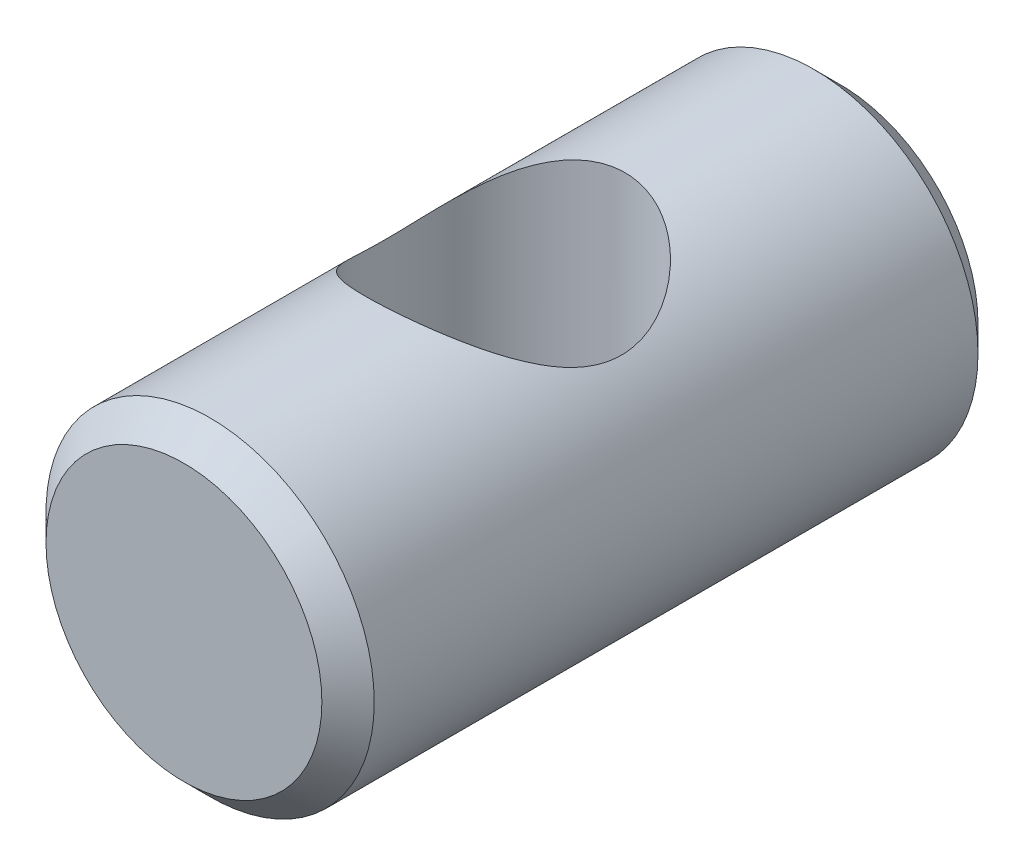
ISO-10303-21;
HEADER;
FILE_DESCRIPTION(('STEP AP214'),'2;1');
FILE_NAME('part.step','',(''),(''),'','','');
FILE_SCHEMA(('AUTOMOTIVE_DESIGN { 1 0 10303 214 1 1 1 1 }'));
ENDSEC;
DATA;
#1=APPLICATION_CONTEXT('core data for automotive mechanical design processes');
#2=APPLICATION_PROTOCOL_DEFINITION('international standard','automotive_design',2000,#1);
#3=PRODUCT_CONTEXT('',#1,'mechanical');
#4=PRODUCT('Part','Part','',(#3));
#5=PRODUCT_RELATED_PRODUCT_CATEGORY('part','',(#4));
#6=PRODUCT_DEFINITION_FORMATION('','',#4);
#7=PRODUCT_DEFINITION_CONTEXT('part definition',#1,'design');
#8=PRODUCT_DEFINITION('design','',#6,#7);
#9=PRODUCT_DEFINITION_SHAPE('','',#8);
#10=(LENGTH_UNIT() NAMED_UNIT(*) SI_UNIT(.MILLI.,.METRE.));
#11=(NAMED_UNIT(*) PLANE_ANGLE_UNIT() SI_UNIT($,.RADIAN.));
#12=(NAMED_UNIT(*) SI_UNIT($,.STERADIAN.) SOLID_ANGLE_UNIT());
#13=UNCERTAINTY_MEASURE_WITH_UNIT(LENGTH_MEASURE(1.E-05),#10,'distance_accuracy_value','');
#14=(GEOMETRIC_REPRESENTATION_CONTEXT(3) GLOBAL_UNCERTAINTY_ASSIGNED_CONTEXT((#13)) GLOBAL_UNIT_ASSIGNED_CONTEXT((#10,
#11,#12)) REPRESENTATION_CONTEXT('',''));
#15=CARTESIAN_POINT('',(0.,0.,0.));
#16=DIRECTION('',(0.,0.,1.));
#17=DIRECTION('',(1.,0.,0.));
#18=AXIS2_PLACEMENT_3D('',#15,#16,#17);
#19=CARTESIAN_POINT('',(0.,0.,9.525));
#20=DIRECTION('',(0.,0.,-1.));
#21=DIRECTION('',(-1.,0.,0.));
#22=AXIS2_PLACEMENT_3D('',#19,#20,#21);
#23=CYLINDRICAL_SURFACE('',#22,4.765);
#24=CARTESIAN_POINT('',(-0.25,-4.75843724346555,3.43));
#25=CARTESIAN_POINT('',(-0.166724112169052,-4.76281167621829,3.42999922787093));
#26=CARTESIAN_POINT('',(-0.0833091871232495,-4.76499730659661,3.42696170981832));
#27=CARTESIAN_POINT('',(0.0831121740296207,-4.7650026918208,3.4148068467804));
#28=CARTESIAN_POINT('',(0.166118334391627,-4.76281982101014,3.40568584755888));
#29=CARTESIAN_POINT('',(0.331186959790397,-4.75419585970188,3.38143299325718));
#30=CARTESIAN_POINT('',(0.413247381645857,-4.74774685395692,3.36628998600944));
#31=CARTESIAN_POINT('',(0.575663796690919,-4.7308054983668,3.33018248201757));
#32=CARTESIAN_POINT('',(0.656019036141792,-4.72031139819935,3.30921546630946));
#33=CARTESIAN_POINT('',(0.892787966377314,-4.68332033908369,3.23819654976144));
#34=CARTESIAN_POINT('',(1.04595137150619,-4.65125389258668,3.17986930590837));
#35=CARTESIAN_POINT('',(1.33984014973707,-4.57527843427846,3.04361904551389));
#36=CARTESIAN_POINT('',(1.48056835886066,-4.5313721320163,2.96570051271122));
#37=CARTESIAN_POINT('',(1.75788689740451,-4.43151908585651,2.78614227044201));
#38=CARTESIAN_POINT('',(1.89336529725831,-4.37491413457117,2.68315702445496));
#39=CARTESIAN_POINT('',(2.14655524443234,-4.25642076403591,2.45967503555253));
#40=CARTESIAN_POINT('',(2.26424375736879,-4.1945256545925,2.33915597919725));
#41=CARTESIAN_POINT('',(2.49954291256701,-4.05942448373215,2.06004986641745));
#42=CARTESIAN_POINT('',(2.61358783923186,-3.98612152048065,1.89848678532065));
#43=CARTESIAN_POINT('',(2.8134167940547,-3.84768475167639,1.55552772477578));
#44=CARTESIAN_POINT('',(2.8992289351292,-3.78254285998121,1.37415171538823));
#45=CARTESIAN_POINT('',(3.02121659224799,-3.68536960684574,1.04249027419633));
#46=CARTESIAN_POINT('',(3.06446847823432,-3.64913089405156,0.896059930245661));
#47=CARTESIAN_POINT('',(3.13130443601069,-3.59195313084762,0.59599414502253));
#48=CARTESIAN_POINT('',(3.15492488386826,-3.57098579230857,0.442372589402984));
#49=CARTESIAN_POINT('',(3.18107400515714,-3.54772325730841,0.130968163534105));
#50=CARTESIAN_POINT('',(3.18348141023251,-3.54553541923722,-0.0268334663617291));
#51=CARTESIAN_POINT('',(3.16668321345997,-3.56054009581889,-0.340378540732283));
#52=CARTESIAN_POINT('',(3.14746550747579,-3.57774346424277,-0.496120783126499));
#53=CARTESIAN_POINT('',(3.0909210961652,-3.62666135115865,-0.789904337023395));
#54=CARTESIAN_POINT('',(3.05498661482471,-3.65725103780533,-0.928415250197683));
#55=CARTESIAN_POINT('',(2.96728528802359,-3.72875878634848,-1.19751261050963));
#56=CARTESIAN_POINT('',(2.91550550146166,-3.76968528568752,-1.3280924753778));
#57=CARTESIAN_POINT('',(2.77052705474689,-3.87825771410624,-1.63782460440973));
#58=CARTESIAN_POINT('',(2.66921327673824,-3.9495685015488,-1.81191316545693));
#59=CARTESIAN_POINT('',(2.4387535532021,-4.09590072272998,-2.13907509935082));
#60=CARTESIAN_POINT('',(2.30955797140353,-4.17092858781235,-2.29211018589258));
#61=CARTESIAN_POINT('',(2.02402160906534,-4.31676779733467,-2.57575490113864));
#62=CARTESIAN_POINT('',(1.86747364912315,-4.38754097750563,-2.70617703034937));
#63=CARTESIAN_POINT('',(1.53024851972964,-4.51618771874562,-2.93894144764791));
#64=CARTESIAN_POINT('',(1.34962456620741,-4.57408899880651,-3.04134418612298));
#65=CARTESIAN_POINT('',(1.01242767734237,-4.65865916827853,-3.19328266988702));
#66=CARTESIAN_POINT('',(0.859923323449721,-4.68945201631652,-3.24956507034397));
#67=CARTESIAN_POINT('',(0.54635690282555,-4.73621910160439,-3.34025251275025));
#68=CARTESIAN_POINT('',(0.385300834260465,-4.75220358398007,-3.37467267483606));
#69=CARTESIAN_POINT('',(0.0585909892563562,-4.76745293508549,-3.42008033355065));
#70=CARTESIAN_POINT('',(-0.107075469726217,-4.76666592499011,-3.43099500658852));
#71=CARTESIAN_POINT('',(-0.437263524427022,-4.74777547003753,-3.42886170148299));
#72=CARTESIAN_POINT('',(-0.601785009912755,-4.72967038048901,-3.41581144729144));
#73=CARTESIAN_POINT('',(-0.917023455984582,-4.67852691536303,-3.36811701365222));
#74=CARTESIAN_POINT('',(-1.06802543846496,-4.64623395849401,-3.33452146005276));
#75=CARTESIAN_POINT('',(-1.36114282577409,-4.56897312306875,-3.2486320258752));
#76=CARTESIAN_POINT('',(-1.5032561767415,-4.52400232821754,-3.19633384236941));
#77=CARTESIAN_POINT('',(-1.78918123830801,-4.41920416422592,-3.06961312822602));
#78=CARTESIAN_POINT('',(-1.93190566387653,-4.35837989651049,-2.99357734594169));
#79=CARTESIAN_POINT('',(-2.20254689954151,-4.22807467175417,-2.82452841204479));
#80=CARTESIAN_POINT('',(-2.3304539546229,-4.15858807365445,-2.73150417873574));
#81=CARTESIAN_POINT('',(-2.59396805594881,-4.00055978130538,-2.51111133608926));
#82=CARTESIAN_POINT('',(-2.72627669731258,-3.9109325153004,-2.38058009592622));
#83=CARTESIAN_POINT('',(-2.96812567159531,-3.73070877587188,-2.100243948315));
#84=CARTESIAN_POINT('',(-3.07764472575725,-3.64011147895989,-1.95042123769023));
#85=CARTESIAN_POINT('',(-3.25959426369705,-3.47751484837525,-1.65330676505373));
#86=CARTESIAN_POINT('',(-3.33502083401562,-3.40464496946818,-1.50833136837071));
#87=CARTESIAN_POINT('',(-3.46586658517558,-3.2713441238456,-1.20430907278381));
#88=CARTESIAN_POINT('',(-3.52132872734755,-3.21088656913652,-1.04529331737332));
#89=CARTESIAN_POINT('',(-3.59765604252707,-3.124823861218,-0.757665304054352));
#90=CARTESIAN_POINT('',(-3.62377560920146,-3.09423907936361,-0.631975559150281));
#91=CARTESIAN_POINT('',(-3.66180814769204,-3.04914510271432,-0.375721470658428));
#92=CARTESIAN_POINT('',(-3.67374715513707,-3.03460645057289,-0.245166515787295));
#93=CARTESIAN_POINT('',(-3.68248381420053,-3.02400445245463,0.017796653452943));
#94=CARTESIAN_POINT('',(-3.67921741545453,-3.02801925946825,0.150210360703106));
#95=CARTESIAN_POINT('',(-3.65769938197026,-3.0539665857314,0.412078573372207));
#96=CARTESIAN_POINT('',(-3.63942784679228,-3.07592289956546,0.54152891416466));
#97=CARTESIAN_POINT('',(-3.58281700309049,-3.14180670904453,0.826729712346176));
#98=CARTESIAN_POINT('',(-3.54052764492096,-3.18993005386834,0.980691312065217));
#99=CARTESIAN_POINT('',(-3.43738681858182,-3.30080253377366,1.2767906566915));
#100=CARTESIAN_POINT('',(-3.37648537626474,-3.36359093675505,1.41889524108079));
#101=CARTESIAN_POINT('',(-3.25927230939949,-3.4766169791788,1.64936888169118));
#102=CARTESIAN_POINT('',(-3.20719498221027,-3.52486634365835,1.7409394575126));
#103=CARTESIAN_POINT('',(-3.09541954727663,-3.62341667346676,1.91819495195357));
#104=CARTESIAN_POINT('',(-3.03571875143679,-3.673718358182,2.0038777780348));
#105=CARTESIAN_POINT('',(-2.90891804374965,-3.77491865704642,2.16931406665596));
#106=CARTESIAN_POINT('',(-2.84181267646787,-3.82581768629146,2.24906308395903));
#107=CARTESIAN_POINT('',(-2.70038920437342,-3.92691720618763,2.40236682455076));
#108=CARTESIAN_POINT('',(-2.62607150215374,-3.9771177356504,2.47592189315842));
#109=CARTESIAN_POINT('',(-2.46949972376396,-4.0762079661732,2.61724277483524));
#110=CARTESIAN_POINT('',(-2.38716864979552,-4.1250776725309,2.68493753880603));
#111=CARTESIAN_POINT('',(-2.21541256265412,-4.21980975535666,2.81310096557156));
#112=CARTESIAN_POINT('',(-2.1259865725645,-4.26567171608716,2.87356863036593));
#113=CARTESIAN_POINT('',(-1.94048293416798,-4.35318701528818,2.98645656939565));
#114=CARTESIAN_POINT('',(-1.8444179349447,-4.39484800441003,3.03889156631573));
#115=CARTESIAN_POINT('',(-1.64605779138663,-4.47292957405361,3.1349771488852));
#116=CARTESIAN_POINT('',(-1.54376590080899,-4.50935285855684,3.17863227184576));
#117=CARTESIAN_POINT('',(-1.28981920639204,-4.58975257088417,3.27242101077825));
#118=CARTESIAN_POINT('',(-1.1352862763967,-4.63059676914717,3.31773285408371));
#119=CARTESIAN_POINT('',(-0.89790283907342,-4.68033819384841,3.36922808334745));
#120=CARTESIAN_POINT('',(-0.817919413239363,-4.69498977614935,3.38364210754006));
#121=CARTESIAN_POINT('',(-0.65651498283896,-4.7202607906775,3.4067980569507));
#122=CARTESIAN_POINT('',(-0.575094809436485,-4.73088247904069,3.41554315786432));
#123=CARTESIAN_POINT('',(-0.452884075948464,-4.74360353870641,3.42423436805334));
#124=CARTESIAN_POINT('',(-0.41239804583362,-4.74729478081944,3.42639368476122));
#125=CARTESIAN_POINT('',(-0.331285742741574,-4.75364382663165,3.42927683030824));
#126=CARTESIAN_POINT('',(-0.29065944377002,-4.7563014271186,3.43000037699194));
#127=CARTESIAN_POINT('',(-0.25,-4.75843724346555,3.43));
#128=B_SPLINE_CURVE_WITH_KNOTS('',3,(#24,#25,#26,#27,#28,#29,#30,#31,#32,#33,#34,#35,#36,#37,
#38,#39,#40,#41,#42,#43,#44,#45,#46,#47,#48,#49,#50,#51,#52,#53,#54,#55,#56,#57,#58,#59,#60,#61,
#62,#63,#64,#65,#66,#67,#68,#69,#70,#71,#72,#73,#74,#75,#76,#77,#78,#79,#80,#81,#82,#83,#84,#85,
#86,#87,#88,#89,#90,#91,#92,#93,#94,#95,#96,#97,#98,#99,#100,#101,#102,#103,#104,#105,#106,#107,
#108,#109,#110,#111,#112,#113,#114,#115,#116,#117,#118,#119,#120,#121,#122,#123,#124,#125,#126,
#127),.UNSPECIFIED.,.T.,.F.,(4,2,2,2,2,2,2,2,2,2,2,2,2,2,2,2,2,2,2,2,2,2,2,2,2,2,2,2,2,2,2,2,2,
2,2,2,2,2,2,2,2,2,2,2,2,2,2,2,2,2,2,4),(0.,0.250128749904401,0.500407883064132,
0.751152683255352,1.00200610335284,1.5005745207861,1.99902893760549,2.53506428284883,
3.0717878497701,3.7017577007417,4.33109834451233,4.80006775596797,5.26816624101772,
5.73893897524922,6.20997534433429,6.64735102377689,7.08508487226794,7.72280008470007,
8.36166008801208,9.005587331222,9.64811417987124,10.1423678843309,10.636279384842,
11.1317189102055,11.6272054919413,12.0992981890246,12.5714995707697,13.0879217874425,
13.6046820813895,14.2214259135373,14.8387430440107,15.3739112332421,15.9079208139713,
16.3022952653858,16.6959445170977,17.0912534507832,17.4870875080064,17.9846304730143,
18.483521274847,18.8307287538684,19.1780590008212,19.5256468793742,19.8732153666977,
20.2245350343439,20.5759031603044,20.926619370564,21.2771538674155,21.7730640559323,
22.0205706255639,22.2679384234592,22.3900397673761,22.512165104096),.UNSPECIFIED.);
#129=CARTESIAN_POINT('',(-0.25,-4.75843724346555,3.43));
#130=VERTEX_POINT('',#129);
#131=EDGE_CURVE('E44',#130,#130,#128,.T.);
#132=ORIENTED_EDGE('',*,*,#131,.T.);
#133=EDGE_LOOP('',(#132));
#134=FACE_BOUND('',#133,.T.);
#135=CARTESIAN_POINT('',(-0.25,4.75843724346555,3.43));
#136=CARTESIAN_POINT('',(-0.422180009069406,4.74939061816699,3.42999980483541));
#137=CARTESIAN_POINT('',(-0.593862827301991,4.73091871113112,3.41695856293195));
#138=CARTESIAN_POINT('',(-0.930629104770303,4.67635636796384,3.36610979440147));
#139=CARTESIAN_POINT('',(-1.09570851357914,4.64025529237457,3.32828730721862));
#140=CARTESIAN_POINT('',(-1.41392411864396,4.55336447971862,3.23075051942857));
#141=CARTESIAN_POINT('',(-1.56712334101048,4.5026601113221,3.17116292636266));
#142=CARTESIAN_POINT('',(-1.85998836726663,4.38979766700268,3.03299834240104));
#143=CARTESIAN_POINT('',(-1.99965414606241,4.32763956984278,2.95442131629586));
#144=CARTESIAN_POINT('',(-2.27820698899914,4.18828982189439,2.77162910883962));
#145=CARTESIAN_POINT('',(-2.41542819149111,4.11020218068904,2.66557505303866));
#146=CARTESIAN_POINT('',(-2.67111072919316,3.94883137284482,2.43572487373919));
#147=CARTESIAN_POINT('',(-2.78953546002452,3.86553849846079,2.31189500490524));
#148=CARTESIAN_POINT('',(-2.96344629098399,3.732292646302,2.10063521621267));
#149=CARTESIAN_POINT('',(-3.02522112465854,3.68226630299909,2.01833701427756));
#150=CARTESIAN_POINT('',(-3.14150590868554,3.58357003530251,1.84790207991889));
#151=CARTESIAN_POINT('',(-3.1960131207988,3.5349006275963,1.7597631654945));
#152=CARTESIAN_POINT('',(-3.29731229261899,3.44060115304685,1.57784833521894));
#153=CARTESIAN_POINT('',(-3.34411822611588,3.39496567295495,1.48408305992192));
#154=CARTESIAN_POINT('',(-3.42959137880208,3.30859742398811,1.29083456033671));
#155=CARTESIAN_POINT('',(-3.46826509160405,3.2678607546062,1.19135597958454));
#156=CARTESIAN_POINT('',(-3.54347659526858,3.18632211811376,0.966712328692859));
#157=CARTESIAN_POINT('',(-3.57812346664731,3.14705996480953,0.840323998552466));
#158=CARTESIAN_POINT('',(-3.63302442402354,3.08352956814293,0.580976208361931));
#159=CARTESIAN_POINT('',(-3.65331272726122,3.05922569654856,0.448033183521056));
#160=CARTESIAN_POINT('',(-3.67812283683354,3.02936636632518,0.177337549423231));
#161=CARTESIAN_POINT('',(-3.68251233934075,3.02396824643502,0.0395541719109345));
#162=CARTESIAN_POINT('',(-3.67470644643728,3.03344305810687,-0.234875874606969));
#163=CARTESIAN_POINT('',(-3.66249943392474,3.04833018879986,-0.371521679960181));
#164=CARTESIAN_POINT('',(-3.62015799382368,3.09852315491188,-0.655828380639309));
#165=CARTESIAN_POINT('',(-3.58799174144691,3.13612809889826,-0.802759414360211));
#166=CARTESIAN_POINT('',(-3.50660899556505,3.22685391573891,-1.08690765852793));
#167=CARTESIAN_POINT('',(-3.45734815065714,3.28001509196861,-1.22409847190397));
#168=CARTESIAN_POINT('',(-3.35999029035731,3.37921222953507,-1.45031682658414));
#169=CARTESIAN_POINT('',(-3.31552748835515,3.42299124550292,-1.54196683547208));
#170=CARTESIAN_POINT('',(-3.21937168211258,3.51357799533849,-1.7198719105116));
#171=CARTESIAN_POINT('',(-3.16767569861283,3.56038697291961,-1.80612473233373));
#172=CARTESIAN_POINT('',(-3.05733519065029,3.655577234441,-1.97327341136435));
#173=CARTESIAN_POINT('',(-2.99868376029761,3.70396004583247,-2.05416381804875));
#174=CARTESIAN_POINT('',(-2.87465956601933,3.80102084509467,-2.21043246978884));
#175=CARTESIAN_POINT('',(-2.80928649472037,3.84969884636826,-2.28581046249783));
#176=CARTESIAN_POINT('',(-2.6702557671566,3.94744940552613,-2.43263894546763));
#177=CARTESIAN_POINT('',(-2.59643405525365,3.99650228404323,-2.50394748039488));
#178=CARTESIAN_POINT('',(-2.44198609531555,4.09270177982323,-2.64020867362414));
#179=CARTESIAN_POINT('',(-2.36135999487914,4.13984843840248,-2.70516146972696));
#180=CARTESIAN_POINT('',(-2.19361254846785,4.2311207520192,-2.82808330517596));
#181=CARTESIAN_POINT('',(-2.10650409604225,4.27525208591359,-2.88606563800173));
#182=CARTESIAN_POINT('',(-1.92594548966524,4.3595756679867,-2.99452956360935));
#183=CARTESIAN_POINT('',(-1.8324951446076,4.39976779737236,-3.04501093021117));
#184=CARTESIAN_POINT('',(-1.58991791011193,4.49465680101692,-3.16160717844564));
#185=CARTESIAN_POINT('',(-1.43688887677843,4.54617300319559,-3.22239703143537));
#186=CARTESIAN_POINT('',(-1.11985321098478,4.63445714602499,-3.3220213557935));
#187=CARTESIAN_POINT('',(-0.955854490731875,4.67123558567514,-3.36087146486794));
#188=CARTESIAN_POINT('',(-0.620041304864637,4.72756501903715,-3.41423360193657));
#189=CARTESIAN_POINT('',(-0.448189976813924,4.74702354164412,-3.42861536060857));
#190=CARTESIAN_POINT('',(-0.103195532056559,4.76701209164517,-3.43119218349009));
#191=CARTESIAN_POINT('',(0.0699472713914471,4.76754656888776,-3.41939340455174));
#192=CARTESIAN_POINT('',(0.396800733953033,4.75102741592386,-3.37216085402572));
#193=CARTESIAN_POINT('',(0.550903795546912,4.73547935394817,-3.33884247322146));
#194=CARTESIAN_POINT('',(0.85126267929708,4.69080460019725,-3.25216372524372));
#195=CARTESIAN_POINT('',(0.99751683451637,4.66167503663273,-3.19879911978834));
#196=CARTESIAN_POINT('',(1.28614476637547,4.59066745677348,-3.07104032256261));
#197=CARTESIAN_POINT('',(1.42797966766526,4.5482360225696,-2.99574591149817));
#198=CARTESIAN_POINT('',(1.69771873358212,4.45459184021555,-2.82781924377908));
#199=CARTESIAN_POINT('',(1.82561916137349,4.40337674596602,-2.73518235437366));
#200=CARTESIAN_POINT('',(2.08559098582612,4.28706511495821,-2.51852707855975));
#201=CARTESIAN_POINT('',(2.2150420244168,4.22105957781513,-2.39185853378127));
#202=CARTESIAN_POINT('',(2.4525288591269,4.08765163666692,-2.119882962336));
#203=CARTESIAN_POINT('',(2.56051870491995,4.02024656957631,-1.97453701758846));
#204=CARTESIAN_POINT('',(2.71141297716131,3.91890470250436,-1.73364032653499));
#205=CARTESIAN_POINT('',(2.76225962831151,3.88310759046258,-1.64375989611527));
#206=CARTESIAN_POINT('',(2.85606768069206,3.81463871939836,-1.45876664530863));
#207=CARTESIAN_POINT('',(2.8990272649147,3.78196768138302,-1.36365262576039));
#208=CARTESIAN_POINT('',(2.97638382467227,3.7213945324715,-1.16888238761678));
#209=CARTESIAN_POINT('',(3.01080676435227,3.6934780438477,-1.06924106056856));
#210=CARTESIAN_POINT('',(3.07061216797024,3.64390866973889,-0.865836413850731));
#211=CARTESIAN_POINT('',(3.09600079900905,3.62225151334222,-0.762075960014791));
#212=CARTESIAN_POINT('',(3.14431905107756,3.58048576732931,-0.514276109849919));
#213=CARTESIAN_POINT('',(3.1632690781055,3.56357947310397,-0.368863877264379));
#214=CARTESIAN_POINT('',(3.18229415057448,3.54660528363273,-0.0759553160984834));
#215=CARTESIAN_POINT('',(3.18238833621043,3.54652031339164,0.0715387471135826));
#216=CARTESIAN_POINT('',(3.16376347579515,3.56313911837427,0.36412784346974));
#217=CARTESIAN_POINT('',(3.14506985693007,3.57982020262542,0.509225849632981));
#218=CARTESIAN_POINT('',(3.09006178812862,3.6274007096972,0.793694678976364));
#219=CARTESIAN_POINT('',(3.05372153995533,3.65832094581284,0.933056792070445));
#220=CARTESIAN_POINT('',(2.94995679839854,3.74283457822027,1.249627259653));
#221=CARTESIAN_POINT('',(2.87616913174531,3.80056128592335,1.42363336901504));
#222=CARTESIAN_POINT('',(2.70309172031867,3.9255469405295,1.75476054116613));
#223=CARTESIAN_POINT('',(2.60375916203549,3.99282180458683,1.91185262262683));
#224=CARTESIAN_POINT('',(2.37965965281677,4.13038218124549,2.21024978907531));
#225=CARTESIAN_POINT('',(2.25446848393284,4.20070005001654,2.35122119961121));
#226=CARTESIAN_POINT('',(1.98132226028618,4.33621841215064,2.61183089931648));
#227=CARTESIAN_POINT('',(1.83339056066265,4.40142405331531,2.73149080683866));
#228=CARTESIAN_POINT('',(1.53413492006617,4.51378899534321,2.93439863762912));
#229=CARTESIAN_POINT('',(1.38501302638156,4.56214832085995,3.02021473285691));
#230=CARTESIAN_POINT('',(1.07249564524745,4.64554146755817,3.16951406225263));
#231=CARTESIAN_POINT('',(0.909111289256104,4.68058556855773,3.23301452201411));
#232=CARTESIAN_POINT('',(0.581478494873658,4.73212589223905,3.33183530764178));
#233=CARTESIAN_POINT('',(0.41780206419677,4.74955942472212,3.36854686433097));
#234=CARTESIAN_POINT('',(0.0859254534274421,4.76711849433293,3.41762518536938));
#235=CARTESIAN_POINT('',(-0.0822731758795952,4.76724989098795,3.43000019011695));
#236=CARTESIAN_POINT('',(-0.25,4.75843724346555,3.43));
#237=B_SPLINE_CURVE_WITH_KNOTS('',3,(#135,#136,#137,#138,#139,#140,#141,#142,#143,#144,#145,
#146,#147,#148,#149,#150,#151,#152,#153,#154,#155,#156,#157,#158,#159,#160,#161,#162,#163,#164,
#165,#166,#167,#168,#169,#170,#171,#172,#173,#174,#175,#176,#177,#178,#179,#180,#181,#182,#183,
#184,#185,#186,#187,#188,#189,#190,#191,#192,#193,#194,#195,#196,#197,#198,#199,#200,#201,#202,
#203,#204,#205,#206,#207,#208,#209,#210,#211,#212,#213,#214,#215,#216,#217,#218,#219,#220,#221,
#222,#223,#224,#225,#226,#227,#228,#229,#230,#231,#232,#233,#234,#235,#236),.UNSPECIFIED.,.T.,
.F.,(4,2,2,2,2,2,2,2,2,2,2,2,2,2,2,2,2,2,2,2,2,2,2,2,2,2,2,2,2,2,2,2,2,2,2,2,2,2,2,2,2,2,2,2,2,
2,2,2,2,2,4),(0.,0.516551025096824,1.03341418220019,1.54731512007828,2.06121701081903,
2.62982932183038,3.19953571462131,3.54246459279583,3.88552231417978,4.22795053195656,
4.57010427222595,4.97905439316965,5.38702665221779,5.79838620186915,6.21003384012951,
6.67262967068467,7.1364347778277,7.46866532411958,7.80103311718076,8.13373371721725,
8.46644953806418,8.80733809568013,9.14821926074384,9.48843965067855,9.82867029735156,
10.3440014803113,10.8589648922706,11.3766614843259,11.8942363430695,12.3673901670618,
12.8406440841658,13.3370245096255,13.8335377244494,14.4096746680997,14.9870321881218,
15.3145391492316,15.6421214663625,15.968694875667,16.2950449261748,16.7357599059526,
17.1760275223247,17.6157000871626,18.0560173690192,18.6457302885718,19.2364380888803,
19.8377403374759,20.4384291081866,20.9723943239786,21.5059464582794,22.0093081125728,
22.5124992983782),.UNSPECIFIED.);
#238=CARTESIAN_POINT('',(-0.25,4.75843724346555,3.43));
#239=VERTEX_POINT('',#238);
#240=EDGE_CURVE('E61',#239,#239,#237,.T.);
#241=ORIENTED_EDGE('',*,*,#240,.T.);
#242=EDGE_LOOP('',(#241));
#243=FACE_BOUND('',#242,.T.);
#244=CARTESIAN_POINT('',(0.,0.,-8.76499999999999));
#245=DIRECTION('',(0.,0.,1.));
#246=DIRECTION('',(1.,0.,0.));
#247=AXIS2_PLACEMENT_3D('',#244,#245,#246);
#248=CIRCLE('',#247,4.765);
#249=CARTESIAN_POINT('',(4.765,0.,-8.76499999999999));
#250=VERTEX_POINT('',#249);
#251=EDGE_CURVE('E58',#250,#250,#248,.T.);
#252=ORIENTED_EDGE('',*,*,#251,.T.);
#253=EDGE_LOOP('',(#252));
#254=FACE_BOUND('',#253,.T.);
#255=CARTESIAN_POINT('',(0.,0.,8.76500000000001));
#256=DIRECTION('',(0.,0.,1.));
#257=DIRECTION('',(1.,0.,0.));
#258=AXIS2_PLACEMENT_3D('',#255,#256,#257);
#259=CIRCLE('',#258,4.765);
#260=CARTESIAN_POINT('',(4.765,0.,8.76500000000001));
#261=VERTEX_POINT('',#260);
#262=EDGE_CURVE('E99',#261,#261,#259,.F.);
#263=ORIENTED_EDGE('',*,*,#262,.T.);
#264=EDGE_LOOP('',(#263));
#265=FACE_BOUND('',#264,.T.);
#266=ADVANCED_FACE('F39',(#134,#243,#254,#265),#23,.T.);
#267=CARTESIAN_POINT('',(0.,0.,9.525));
#268=DIRECTION('',(0.,0.,1.));
#269=DIRECTION('',(1.,0.,0.));
#270=AXIS2_PLACEMENT_3D('',#267,#268,#269);
#271=PLANE('',#270);
#272=CARTESIAN_POINT('',(0.,0.,9.525));
#273=DIRECTION('',(0.,0.,1.));
#274=DIRECTION('',(1.,0.,0.));
#275=AXIS2_PLACEMENT_3D('',#272,#273,#274);
#276=CIRCLE('',#275,4.00500000000001);
#277=CARTESIAN_POINT('',(4.00500000000001,0.,9.525));
#278=VERTEX_POINT('',#277);
#279=EDGE_CURVE('E10',#278,#278,#276,.T.);
#280=ORIENTED_EDGE('',*,*,#279,.T.);
#281=EDGE_LOOP('',(#280));
#282=FACE_BOUND('',#281,.T.);
#283=ADVANCED_FACE('F73',(#282),#271,.T.);
#284=CARTESIAN_POINT('',(0.,0.,-9.525));
#285=DIRECTION('',(0.,0.,1.));
#286=DIRECTION('',(1.,0.,0.));
#287=AXIS2_PLACEMENT_3D('',#284,#285,#286);
#288=PLANE('',#287);
#289=CARTESIAN_POINT('',(0.,0.,-9.525));
#290=DIRECTION('',(0.,0.,1.));
#291=DIRECTION('',(1.,0.,0.));
#292=AXIS2_PLACEMENT_3D('',#289,#290,#291);
#293=CIRCLE('',#292,4.00499999999998);
#294=CARTESIAN_POINT('',(4.00499999999998,0.,-9.525));
#295=VERTEX_POINT('',#294);
#296=EDGE_CURVE('E53',#295,#295,#293,.F.);
#297=ORIENTED_EDGE('',*,*,#296,.T.);
#298=EDGE_LOOP('',(#297));
#299=FACE_BOUND('',#298,.T.);
#300=ADVANCED_FACE('F76',(#299),#288,.F.);
#301=CARTESIAN_POINT('',(0.,0.,-8.76499999999999));
#302=DIRECTION('',(0.,0.,1.));
#303=DIRECTION('',(1.,0.,0.));
#304=AXIS2_PLACEMENT_3D('',#301,#302,#303);
#305=CONICAL_SURFACE('',#304,4.765,0.785398163397451);
#306=ORIENTED_EDGE('',*,*,#296,.F.);
#307=EDGE_LOOP('',(#306));
#308=FACE_BOUND('',#307,.T.);
#309=ORIENTED_EDGE('',*,*,#251,.F.);
#310=EDGE_LOOP('',(#309));
#311=FACE_BOUND('',#310,.T.);
#312=ADVANCED_FACE('F78',(#308,#311),#305,.T.);
#313=CARTESIAN_POINT('',(0.,0.,9.525));
#314=DIRECTION('',(0.,0.,-1.));
#315=DIRECTION('',(-1.,0.,0.));
#316=AXIS2_PLACEMENT_3D('',#313,#314,#315);
#317=CONICAL_SURFACE('',#316,4.00500000000001,0.785398163397448);
#318=ORIENTED_EDGE('',*,*,#262,.F.);
#319=EDGE_LOOP('',(#318));
#320=FACE_BOUND('',#319,.T.);
#321=ORIENTED_EDGE('',*,*,#279,.F.);
#322=EDGE_LOOP('',(#321));
#323=FACE_BOUND('',#322,.T.);
#324=ADVANCED_FACE('F42',(#320,#323),#317,.T.);
#325=CARTESIAN_POINT('',(-0.25,-9.525,0.));
#326=DIRECTION('',(0.,1.,0.));
#327=DIRECTION('',(0.,0.,1.));
#328=AXIS2_PLACEMENT_3D('',#325,#326,#327);
#329=CYLINDRICAL_SURFACE('',#328,3.43);
#330=ORIENTED_EDGE('',*,*,#240,.F.);
#331=EDGE_LOOP('',(#330));
#332=FACE_BOUND('',#331,.T.);
#333=ORIENTED_EDGE('',*,*,#131,.F.);
#334=EDGE_LOOP('',(#333));
#335=FACE_BOUND('',#334,.T.);
#336=ADVANCED_FACE('F68',(#332,#335),#329,.F.);
#337=CLOSED_SHELL('',(#266,#283,#300,#312,#324,#336));
#338=MANIFOLD_SOLID_BREP('B2',#337);
#339=ADVANCED_BREP_SHAPE_REPRESENTATION('',(#18,#338),#14);
#340=SHAPE_DEFINITION_REPRESENTATION(#9,#339);
ENDSEC;
END-ISO-10303-21;
